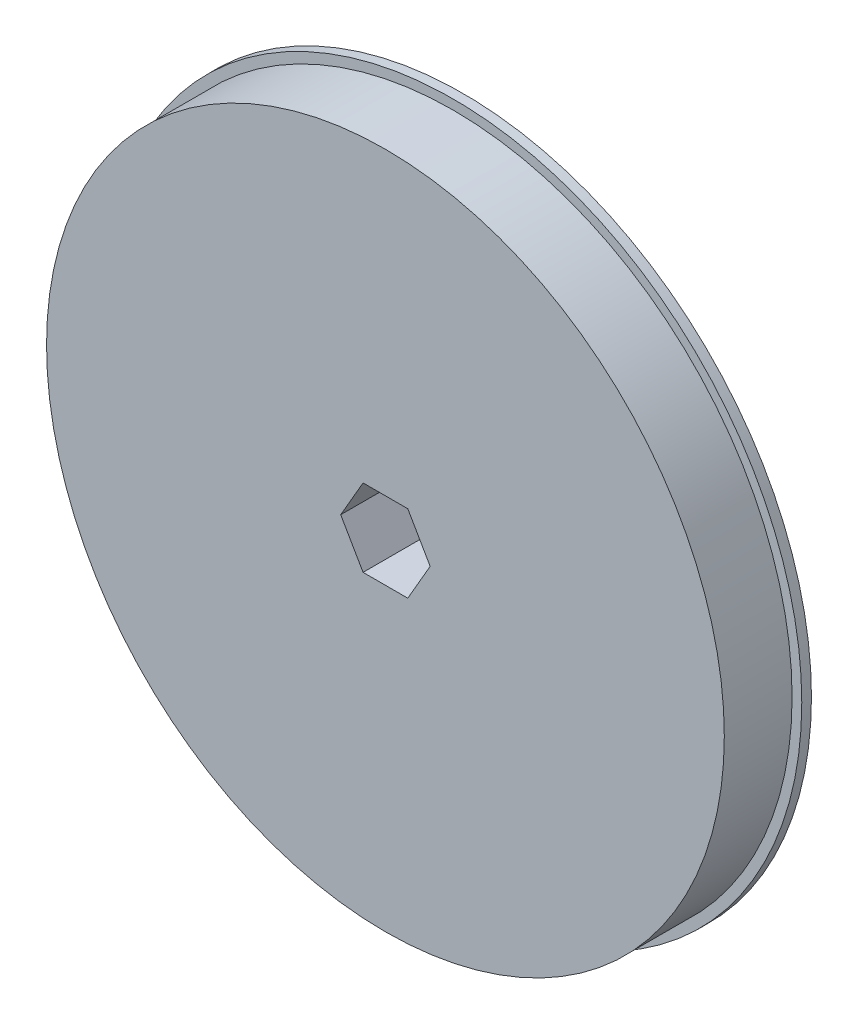
ISO-10303-21;
HEADER;
FILE_DESCRIPTION(('STEP AP214'),'2;1');
FILE_NAME('part.step','',(''),(''),'','','');
FILE_SCHEMA(('AUTOMOTIVE_DESIGN { 1 0 10303 214 1 1 1 1 }'));
ENDSEC;
DATA;
#1=APPLICATION_CONTEXT('core data for automotive mechanical design processes');
#2=APPLICATION_PROTOCOL_DEFINITION('international standard','automotive_design',2000,#1);
#3=PRODUCT_CONTEXT('',#1,'mechanical');
#4=PRODUCT('Part','Part','',(#3));
#5=PRODUCT_RELATED_PRODUCT_CATEGORY('part','',(#4));
#6=PRODUCT_DEFINITION_FORMATION('','',#4);
#7=PRODUCT_DEFINITION_CONTEXT('part definition',#1,'design');
#8=PRODUCT_DEFINITION('design','',#6,#7);
#9=PRODUCT_DEFINITION_SHAPE('','',#8);
#10=(LENGTH_UNIT() NAMED_UNIT(*) SI_UNIT(.MILLI.,.METRE.));
#11=(NAMED_UNIT(*) PLANE_ANGLE_UNIT() SI_UNIT($,.RADIAN.));
#12=(NAMED_UNIT(*) SI_UNIT($,.STERADIAN.) SOLID_ANGLE_UNIT());
#13=UNCERTAINTY_MEASURE_WITH_UNIT(LENGTH_MEASURE(1.E-05),#10,'distance_accuracy_value','');
#14=(GEOMETRIC_REPRESENTATION_CONTEXT(3) GLOBAL_UNCERTAINTY_ASSIGNED_CONTEXT((#13)) GLOBAL_UNIT_ASSIGNED_CONTEXT((#10,
#11,#12)) REPRESENTATION_CONTEXT('',''));
#15=CARTESIAN_POINT('',(0.,0.,0.));
#16=DIRECTION('',(0.,0.,1.));
#17=DIRECTION('',(1.,0.,0.));
#18=AXIS2_PLACEMENT_3D('',#15,#16,#17);
#19=CARTESIAN_POINT('',(0.,0.,9.525));
#20=DIRECTION('',(0.,0.,-1.));
#21=DIRECTION('',(-1.,0.,0.));
#22=AXIS2_PLACEMENT_3D('',#19,#20,#21);
#23=PLANE('',#22);
#24=CARTESIAN_POINT('',(0.,0.,9.525));
#25=DIRECTION('',(0.,0.,-1.));
#26=DIRECTION('',(-1.,0.,0.));
#27=AXIS2_PLACEMENT_3D('',#24,#25,#26);
#28=CIRCLE('',#27,50.8);
#29=CARTESIAN_POINT('',(-50.8,0.,9.525));
#30=VERTEX_POINT('',#29);
#31=EDGE_CURVE('E139',#30,#30,#28,.T.);
#32=ORIENTED_EDGE('',*,*,#31,.T.);
#33=EDGE_LOOP('',(#32));
#34=FACE_BOUND('',#33,.T.);
#35=CARTESIAN_POINT('',(0.,0.,9.525));
#36=DIRECTION('',(0.,0.,-1.));
#37=DIRECTION('',(-1.,0.,0.));
#38=AXIS2_PLACEMENT_3D('',#35,#36,#37);
#39=CIRCLE('',#38,12.7);
#40=CARTESIAN_POINT('',(-12.7,0.,9.525));
#41=VERTEX_POINT('',#40);
#42=EDGE_CURVE('E135',#41,#41,#39,.T.);
#43=ORIENTED_EDGE('',*,*,#42,.F.);
#44=EDGE_LOOP('',(#43));
#45=FACE_BOUND('',#44,.T.);
#46=ADVANCED_FACE('F33',(#34,#45),#23,.T.);
#47=CARTESIAN_POINT('',(0.,0.,12.7));
#48=DIRECTION('',(0.,0.,-1.));
#49=DIRECTION('',(-1.,0.,0.));
#50=AXIS2_PLACEMENT_3D('',#47,#48,#49);
#51=CYLINDRICAL_SURFACE('',#50,57.15);
#52=CARTESIAN_POINT('',(0.,0.,0.));
#53=DIRECTION('',(0.,0.,1.));
#54=DIRECTION('',(1.,0.,0.));
#55=AXIS2_PLACEMENT_3D('',#52,#53,#54);
#56=CIRCLE('',#55,57.15);
#57=CARTESIAN_POINT('',(57.15,0.,0.));
#58=VERTEX_POINT('',#57);
#59=EDGE_CURVE('E153',#58,#58,#56,.T.);
#60=ORIENTED_EDGE('',*,*,#59,.T.);
#61=EDGE_LOOP('',(#60));
#62=FACE_BOUND('',#61,.T.);
#63=CARTESIAN_POINT('',(0.,0.,1.5875));
#64=DIRECTION('',(0.,0.,1.));
#65=DIRECTION('',(1.,0.,0.));
#66=AXIS2_PLACEMENT_3D('',#63,#64,#65);
#67=CIRCLE('',#66,57.15);
#68=CARTESIAN_POINT('',(57.15,0.,1.5875));
#69=VERTEX_POINT('',#68);
#70=EDGE_CURVE('E148',#69,#69,#67,.T.);
#71=ORIENTED_EDGE('',*,*,#70,.F.);
#72=EDGE_LOOP('',(#71));
#73=FACE_BOUND('',#72,.T.);
#74=ADVANCED_FACE('F167',(#62,#73),#51,.T.);
#75=CARTESIAN_POINT('',(0.,0.,0.));
#76=DIRECTION('',(0.,0.,1.));
#77=DIRECTION('',(1.,0.,0.));
#78=AXIS2_PLACEMENT_3D('',#75,#76,#77);
#79=PLANE('',#78);
#80=CARTESIAN_POINT('',(0.,0.,0.));
#81=DIRECTION('',(0.,0.,-1.));
#82=DIRECTION('',(-1.,0.,0.));
#83=AXIS2_PLACEMENT_3D('',#80,#81,#82);
#84=CIRCLE('',#83,50.8);
#85=CARTESIAN_POINT('',(-50.8,0.,0.));
#86=VERTEX_POINT('',#85);
#87=EDGE_CURVE('E138',#86,#86,#84,.T.);
#88=ORIENTED_EDGE('',*,*,#87,.F.);
#89=EDGE_LOOP('',(#88));
#90=FACE_BOUND('',#89,.T.);
#91=ORIENTED_EDGE('',*,*,#59,.F.);
#92=EDGE_LOOP('',(#91));
#93=FACE_BOUND('',#92,.T.);
#94=ADVANCED_FACE('F173',(#90,#93),#79,.F.);
#95=CARTESIAN_POINT('',(0.,0.,1.5875));
#96=DIRECTION('',(0.,0.,1.));
#97=DIRECTION('',(1.,0.,0.));
#98=AXIS2_PLACEMENT_3D('',#95,#96,#97);
#99=PLANE('',#98);
#100=CARTESIAN_POINT('',(0.,0.,1.5875));
#101=DIRECTION('',(0.,0.,1.));
#102=DIRECTION('',(1.,0.,0.));
#103=AXIS2_PLACEMENT_3D('',#100,#101,#102);
#104=CIRCLE('',#103,55.5625);
#105=CARTESIAN_POINT('',(55.5625,0.,1.5875));
#106=VERTEX_POINT('',#105);
#107=EDGE_CURVE('E145',#106,#106,#104,.T.);
#108=ORIENTED_EDGE('',*,*,#107,.F.);
#109=EDGE_LOOP('',(#108));
#110=FACE_BOUND('',#109,.T.);
#111=ORIENTED_EDGE('',*,*,#70,.T.);
#112=EDGE_LOOP('',(#111));
#113=FACE_BOUND('',#112,.T.);
#114=ADVANCED_FACE('F188',(#110,#113),#99,.T.);
#115=CARTESIAN_POINT('',(0.,0.,1.5875));
#116=DIRECTION('',(0.,0.,1.));
#117=DIRECTION('',(1.,0.,0.));
#118=AXIS2_PLACEMENT_3D('',#115,#116,#117);
#119=CYLINDRICAL_SURFACE('',#118,55.5625);
#120=ORIENTED_EDGE('',*,*,#107,.T.);
#121=EDGE_LOOP('',(#120));
#122=FACE_BOUND('',#121,.T.);
#123=CARTESIAN_POINT('',(0.,0.,12.7));
#124=DIRECTION('',(0.,0.,1.));
#125=DIRECTION('',(1.,0.,0.));
#126=AXIS2_PLACEMENT_3D('',#123,#124,#125);
#127=CIRCLE('',#126,55.5625);
#128=CARTESIAN_POINT('',(55.5625,0.,12.7));
#129=VERTEX_POINT('',#128);
#130=EDGE_CURVE('E142',#129,#129,#127,.T.);
#131=ORIENTED_EDGE('',*,*,#130,.F.);
#132=EDGE_LOOP('',(#131));
#133=FACE_BOUND('',#132,.T.);
#134=ADVANCED_FACE('F185',(#122,#133),#119,.T.);
#135=CARTESIAN_POINT('',(0.,0.,12.7));
#136=DIRECTION('',(0.,0.,1.));
#137=DIRECTION('',(1.,0.,0.));
#138=AXIS2_PLACEMENT_3D('',#135,#136,#137);
#139=PLANE('',#138);
#140=DIRECTION('',(0.5,-0.866025403784439,0.));
#141=VECTOR('',#140,1.);
#142=CARTESIAN_POINT('',(-5.49926131403119,-3.175,12.7));
#143=LINE('',#142,#141);
#144=CARTESIAN_POINT('',(-7.33234841870825,0.,12.7));
#145=VERTEX_POINT('',#144);
#146=CARTESIAN_POINT('',(-3.66617420935412,-6.35,12.7));
#147=VERTEX_POINT('',#146);
#148=EDGE_CURVE('E133',#145,#147,#143,.T.);
#149=ORIENTED_EDGE('',*,*,#148,.F.);
#150=DIRECTION('',(-0.5,-0.866025403784439,0.));
#151=VECTOR('',#150,1.);
#152=CARTESIAN_POINT('',(-5.49926131403119,3.175,12.7));
#153=LINE('',#152,#151);
#154=CARTESIAN_POINT('',(-3.66617420935412,6.35,12.7));
#155=VERTEX_POINT('',#154);
#156=EDGE_CURVE('E118',#155,#145,#153,.T.);
#157=ORIENTED_EDGE('',*,*,#156,.F.);
#158=DIRECTION('',(-1.,0.,0.));
#159=VECTOR('',#158,1.);
#160=CARTESIAN_POINT('',(0.,6.35,12.7));
#161=LINE('',#160,#159);
#162=CARTESIAN_POINT('',(3.66617420935412,6.35000000000001,12.7));
#163=VERTEX_POINT('',#162);
#164=EDGE_CURVE('E92',#163,#155,#161,.T.);
#165=ORIENTED_EDGE('',*,*,#164,.F.);
#166=DIRECTION('',(-0.5,0.866025403784439,0.));
#167=VECTOR('',#166,1.);
#168=CARTESIAN_POINT('',(5.49926131403119,3.175,12.7));
#169=LINE('',#168,#167);
#170=CARTESIAN_POINT('',(7.33234841870825,0.,12.7));
#171=VERTEX_POINT('',#170);
#172=EDGE_CURVE('E127',#171,#163,#169,.T.);
#173=ORIENTED_EDGE('',*,*,#172,.F.);
#174=DIRECTION('',(0.5,0.866025403784439,0.));
#175=VECTOR('',#174,1.);
#176=CARTESIAN_POINT('',(5.49926131403119,-3.175,12.7));
#177=LINE('',#176,#175);
#178=CARTESIAN_POINT('',(3.66617420935413,-6.35,12.7));
#179=VERTEX_POINT('',#178);
#180=EDGE_CURVE('E129',#179,#171,#177,.T.);
#181=ORIENTED_EDGE('',*,*,#180,.F.);
#182=DIRECTION('',(1.,0.,0.));
#183=VECTOR('',#182,1.);
#184=CARTESIAN_POINT('',(0.,-6.35,12.7));
#185=LINE('',#184,#183);
#186=EDGE_CURVE('E131',#147,#179,#185,.T.);
#187=ORIENTED_EDGE('',*,*,#186,.F.);
#188=EDGE_LOOP('',(#149,#157,#165,#173,#181,#187));
#189=FACE_BOUND('',#188,.T.);
#190=ORIENTED_EDGE('',*,*,#130,.T.);
#191=EDGE_LOOP('',(#190));
#192=FACE_BOUND('',#191,.T.);
#193=ADVANCED_FACE('F183',(#189,#192),#139,.T.);
#194=CARTESIAN_POINT('',(0.,0.,9.525));
#195=DIRECTION('',(0.,0.,-1.));
#196=DIRECTION('',(-1.,0.,0.));
#197=AXIS2_PLACEMENT_3D('',#194,#195,#196);
#198=CYLINDRICAL_SURFACE('',#197,50.8);
#199=CARTESIAN_POINT('',(-50.8,0.,9.525));
#200=CARTESIAN_POINT('',(-50.8,0.,9.42578125));
#201=CARTESIAN_POINT('',(-50.8,0.,9.3265625));
#202=CARTESIAN_POINT('',(-50.8,0.,9.128125));
#203=CARTESIAN_POINT('',(-50.8,0.,9.02890625));
#204=CARTESIAN_POINT('',(-50.8,0.,8.83046875));
#205=CARTESIAN_POINT('',(-50.8,0.,8.73125));
#206=CARTESIAN_POINT('',(-50.8,0.,8.5328125));
#207=CARTESIAN_POINT('',(-50.8,0.,8.43359375));
#208=CARTESIAN_POINT('',(-50.8,0.,8.23515625));
#209=CARTESIAN_POINT('',(-50.8,0.,8.1359375));
#210=CARTESIAN_POINT('',(-50.8,0.,7.9375));
#211=CARTESIAN_POINT('',(-50.8,0.,7.83828125));
#212=CARTESIAN_POINT('',(-50.8,0.,7.63984375));
#213=CARTESIAN_POINT('',(-50.8,0.,7.540625));
#214=CARTESIAN_POINT('',(-50.8,0.,7.3421875));
#215=CARTESIAN_POINT('',(-50.8,0.,7.24296875));
#216=CARTESIAN_POINT('',(-50.8,0.,7.04453125));
#217=CARTESIAN_POINT('',(-50.8,0.,6.9453125));
#218=CARTESIAN_POINT('',(-50.8,0.,6.746875));
#219=CARTESIAN_POINT('',(-50.8,0.,6.64765625));
#220=CARTESIAN_POINT('',(-50.8,0.,6.44921875));
#221=CARTESIAN_POINT('',(-50.8,0.,6.35));
#222=CARTESIAN_POINT('',(-50.8,0.,6.1515625));
#223=CARTESIAN_POINT('',(-50.8,0.,6.05234375));
#224=CARTESIAN_POINT('',(-50.8,0.,5.85390625));
#225=CARTESIAN_POINT('',(-50.8,0.,5.7546875));
#226=CARTESIAN_POINT('',(-50.8,0.,5.55625));
#227=CARTESIAN_POINT('',(-50.8,0.,5.45703125));
#228=CARTESIAN_POINT('',(-50.8,0.,5.25859375));
#229=CARTESIAN_POINT('',(-50.8,0.,5.159375));
#230=CARTESIAN_POINT('',(-50.8,0.,4.9609375));
#231=CARTESIAN_POINT('',(-50.8,0.,4.86171875));
#232=CARTESIAN_POINT('',(-50.8,0.,4.66328125));
#233=CARTESIAN_POINT('',(-50.8,0.,4.5640625));
#234=CARTESIAN_POINT('',(-50.8,0.,4.365625));
#235=CARTESIAN_POINT('',(-50.8,0.,4.26640625));
#236=CARTESIAN_POINT('',(-50.8,0.,4.06796875));
#237=CARTESIAN_POINT('',(-50.8,0.,3.96875));
#238=CARTESIAN_POINT('',(-50.8,0.,3.7703125));
#239=CARTESIAN_POINT('',(-50.8,0.,3.67109375));
#240=CARTESIAN_POINT('',(-50.8,0.,3.47265625));
#241=CARTESIAN_POINT('',(-50.8,0.,3.3734375));
#242=CARTESIAN_POINT('',(-50.8,0.,3.175));
#243=CARTESIAN_POINT('',(-50.8,0.,3.07578125));
#244=CARTESIAN_POINT('',(-50.8,0.,2.87734375));
#245=CARTESIAN_POINT('',(-50.8,0.,2.778125));
#246=CARTESIAN_POINT('',(-50.8,0.,2.5796875));
#247=CARTESIAN_POINT('',(-50.8,0.,2.48046875));
#248=CARTESIAN_POINT('',(-50.8,0.,2.28203125));
#249=CARTESIAN_POINT('',(-50.8,0.,2.1828125));
#250=CARTESIAN_POINT('',(-50.8,0.,1.984375));
#251=CARTESIAN_POINT('',(-50.8,0.,1.88515625));
#252=CARTESIAN_POINT('',(-50.8,0.,1.68671875));
#253=CARTESIAN_POINT('',(-50.8,0.,1.5875));
#254=CARTESIAN_POINT('',(-50.8,0.,1.3890625));
#255=CARTESIAN_POINT('',(-50.8,0.,1.28984375));
#256=CARTESIAN_POINT('',(-50.8,0.,1.09140625));
#257=CARTESIAN_POINT('',(-50.8,0.,0.992187500000001));
#258=CARTESIAN_POINT('',(-50.8,0.,0.793750000000001));
#259=CARTESIAN_POINT('',(-50.8,0.,0.69453125));
#260=CARTESIAN_POINT('',(-50.8,0.,0.49609375));
#261=CARTESIAN_POINT('',(-50.8,0.,0.396875));
#262=CARTESIAN_POINT('',(-50.8,0.,0.1984375));
#263=CARTESIAN_POINT('',(-50.8,0.,0.0992187500000001));
#264=CARTESIAN_POINT('',(-50.8,0.,0.));
#265=B_SPLINE_CURVE_WITH_KNOTS('',3,(#199,#200,#201,#202,#203,#204,#205,#206,#207,#208,#209,
#210,#211,#212,#213,#214,#215,#216,#217,#218,#219,#220,#221,#222,#223,#224,#225,#226,#227,#228,
#229,#230,#231,#232,#233,#234,#235,#236,#237,#238,#239,#240,#241,#242,#243,#244,#245,#246,#247,
#248,#249,#250,#251,#252,#253,#254,#255,#256,#257,#258,#259,#260,#261,#262,#263,#264),
.UNSPECIFIED.,.F.,.F.,(4,2,2,2,2,2,2,2,2,2,2,2,2,2,2,2,2,2,2,2,2,2,2,2,2,2,2,2,2,2,2,2,4),(0.,
0.29765625,0.5953125,0.892968750000001,1.190625,1.48828125,1.7859375,2.08359375,2.38125,
2.67890625,2.9765625,3.27421875,3.571875,3.86953125,4.1671875,4.46484375,4.7625,5.06015625,
5.3578125,5.65546875,5.953125,6.25078125,6.5484375,6.84609375,7.14375,7.44140625,7.7390625,
8.03671875,8.334375,8.63203125,8.9296875,9.22734375,9.525),.UNSPECIFIED.);
#266=EDGE_CURVE('BSEAM180',#30,#86,#265,.T.);
#267=ORIENTED_EDGE('',*,*,#31,.F.);
#268=ORIENTED_EDGE('',*,*,#87,.T.);
#269=ORIENTED_EDGE('',*,*,#266,.T.);
#270=ORIENTED_EDGE('',*,*,#266,.F.);
#271=EDGE_LOOP('',(#267,#269,#268,#270));
#272=FACE_BOUND('',#271,.T.);
#273=ADVANCED_FACE('F180',(#272),#198,.F.);
#274=CARTESIAN_POINT('',(0.,0.,3.175));
#275=DIRECTION('',(0.,0.,1.));
#276=DIRECTION('',(1.,0.,0.));
#277=AXIS2_PLACEMENT_3D('',#274,#275,#276);
#278=CYLINDRICAL_SURFACE('',#277,12.7);
#279=CARTESIAN_POINT('',(0.,0.,3.96875000000003));
#280=DIRECTION('',(0.,0.,-1.));
#281=DIRECTION('',(-1.,0.,0.));
#282=AXIS2_PLACEMENT_3D('',#279,#280,#281);
#283=CIRCLE('',#282,12.7);
#284=CARTESIAN_POINT('',(-12.7,0.,3.96875000000003));
#285=VERTEX_POINT('',#284);
#286=EDGE_CURVE('E11',#285,#285,#283,.F.);
#287=ORIENTED_EDGE('',*,*,#286,.T.);
#288=EDGE_LOOP('',(#287));
#289=FACE_BOUND('',#288,.T.);
#290=ORIENTED_EDGE('',*,*,#42,.T.);
#291=EDGE_LOOP('',(#290));
#292=FACE_BOUND('',#291,.T.);
#293=ADVANCED_FACE('F178',(#289,#292),#278,.T.);
#294=CARTESIAN_POINT('',(0.,0.,3.175));
#295=DIRECTION('',(0.,0.,-1.));
#296=DIRECTION('',(-1.,0.,0.));
#297=AXIS2_PLACEMENT_3D('',#294,#295,#296);
#298=PLANE('',#297);
#299=CARTESIAN_POINT('',(0.,0.,3.175));
#300=DIRECTION('',(0.,0.,-1.));
#301=DIRECTION('',(-1.,0.,0.));
#302=AXIS2_PLACEMENT_3D('',#299,#300,#301);
#303=CIRCLE('',#302,11.90625);
#304=CARTESIAN_POINT('',(-11.90625,0.,3.175));
#305=VERTEX_POINT('',#304);
#306=EDGE_CURVE('E41',#305,#305,#303,.T.);
#307=ORIENTED_EDGE('',*,*,#306,.T.);
#308=EDGE_LOOP('',(#307));
#309=FACE_BOUND('',#308,.T.);
#310=DIRECTION('',(-0.5,0.866025403784439,0.));
#311=VECTOR('',#310,1.);
#312=CARTESIAN_POINT('',(-3.66617420935412,-6.35,3.175));
#313=LINE('',#312,#311);
#314=CARTESIAN_POINT('',(-3.66617420935412,-6.35,3.175));
#315=VERTEX_POINT('',#314);
#316=CARTESIAN_POINT('',(-7.33234841870825,0.,3.175));
#317=VERTEX_POINT('',#316);
#318=EDGE_CURVE('E56',#315,#317,#313,.T.);
#319=ORIENTED_EDGE('',*,*,#318,.F.);
#320=DIRECTION('',(-1.,0.,0.));
#321=VECTOR('',#320,1.);
#322=CARTESIAN_POINT('',(3.66617420935413,-6.35,3.175));
#323=LINE('',#322,#321);
#324=CARTESIAN_POINT('',(3.66617420935413,-6.35,3.175));
#325=VERTEX_POINT('',#324);
#326=EDGE_CURVE('E113',#325,#315,#323,.T.);
#327=ORIENTED_EDGE('',*,*,#326,.F.);
#328=DIRECTION('',(-0.5,-0.866025403784439,0.));
#329=VECTOR('',#328,1.);
#330=CARTESIAN_POINT('',(7.33234841870825,0.,3.175));
#331=LINE('',#330,#329);
#332=CARTESIAN_POINT('',(7.33234841870825,0.,3.175));
#333=VERTEX_POINT('',#332);
#334=EDGE_CURVE('E107',#333,#325,#331,.T.);
#335=ORIENTED_EDGE('',*,*,#334,.F.);
#336=DIRECTION('',(0.5,-0.866025403784439,0.));
#337=VECTOR('',#336,1.);
#338=CARTESIAN_POINT('',(3.66617420935412,6.35000000000001,3.175));
#339=LINE('',#338,#337);
#340=CARTESIAN_POINT('',(3.66617420935412,6.35000000000001,3.175));
#341=VERTEX_POINT('',#340);
#342=EDGE_CURVE('E105',#341,#333,#339,.T.);
#343=ORIENTED_EDGE('',*,*,#342,.F.);
#344=DIRECTION('',(1.,0.,0.));
#345=VECTOR('',#344,1.);
#346=CARTESIAN_POINT('',(-3.66617420935412,6.35,3.175));
#347=LINE('',#346,#345);
#348=CARTESIAN_POINT('',(-3.66617420935412,6.35,3.175));
#349=VERTEX_POINT('',#348);
#350=EDGE_CURVE('E89',#349,#341,#347,.T.);
#351=ORIENTED_EDGE('',*,*,#350,.F.);
#352=DIRECTION('',(0.5,0.866025403784439,0.));
#353=VECTOR('',#352,1.);
#354=CARTESIAN_POINT('',(-7.33234841870825,0.,3.175));
#355=LINE('',#354,#353);
#356=EDGE_CURVE('E98',#317,#349,#355,.T.);
#357=ORIENTED_EDGE('',*,*,#356,.F.);
#358=EDGE_LOOP('',(#319,#327,#335,#343,#351,#357));
#359=FACE_BOUND('',#358,.T.);
#360=ADVANCED_FACE('F102',(#309,#359),#298,.T.);
#361=CARTESIAN_POINT('',(-3.66617420935412,-6.35,15.875));
#362=DIRECTION('',(-0.866025403784439,-0.5,0.));
#363=DIRECTION('',(0.5,-0.866025403784439,0.));
#364=AXIS2_PLACEMENT_3D('',#361,#362,#363);
#365=PLANE('',#364);
#366=ORIENTED_EDGE('',*,*,#148,.T.);
#367=DIRECTION('',(0.,0.,-1.));
#368=VECTOR('',#367,1.);
#369=CARTESIAN_POINT('',(-3.66617420935412,-6.35,15.875));
#370=LINE('',#369,#368);
#371=EDGE_CURVE('E116',#147,#315,#370,.T.);
#372=ORIENTED_EDGE('',*,*,#371,.T.);
#373=ORIENTED_EDGE('',*,*,#318,.T.);
#374=DIRECTION('',(0.,0.,-1.));
#375=VECTOR('',#374,1.);
#376=CARTESIAN_POINT('',(-7.33234841870825,0.,15.875));
#377=LINE('',#376,#375);
#378=EDGE_CURVE('E95',#145,#317,#377,.T.);
#379=ORIENTED_EDGE('',*,*,#378,.F.);
#380=EDGE_LOOP('',(#366,#372,#373,#379));
#381=FACE_BOUND('',#380,.T.);
#382=ADVANCED_FACE('F239',(#381),#365,.F.);
#383=CARTESIAN_POINT('',(3.66617420935413,-6.35,15.875));
#384=DIRECTION('',(0.,-1.,0.));
#385=DIRECTION('',(1.,0.,0.));
#386=AXIS2_PLACEMENT_3D('',#383,#384,#385);
#387=PLANE('',#386);
#388=ORIENTED_EDGE('',*,*,#186,.T.);
#389=DIRECTION('',(0.,0.,-1.));
#390=VECTOR('',#389,1.);
#391=CARTESIAN_POINT('',(3.66617420935413,-6.35,15.875));
#392=LINE('',#391,#390);
#393=EDGE_CURVE('E119',#179,#325,#392,.T.);
#394=ORIENTED_EDGE('',*,*,#393,.T.);
#395=ORIENTED_EDGE('',*,*,#326,.T.);
#396=ORIENTED_EDGE('',*,*,#371,.F.);
#397=EDGE_LOOP('',(#388,#394,#395,#396));
#398=FACE_BOUND('',#397,.T.);
#399=ADVANCED_FACE('F244',(#398),#387,.F.);
#400=CARTESIAN_POINT('',(7.33234841870825,0.,15.875));
#401=DIRECTION('',(0.866025403784439,-0.5,0.));
#402=DIRECTION('',(0.5,0.866025403784439,0.));
#403=AXIS2_PLACEMENT_3D('',#400,#401,#402);
#404=PLANE('',#403);
#405=ORIENTED_EDGE('',*,*,#180,.T.);
#406=DIRECTION('',(0.,0.,-1.));
#407=VECTOR('',#406,1.);
#408=CARTESIAN_POINT('',(7.33234841870825,0.,15.875));
#409=LINE('',#408,#407);
#410=EDGE_CURVE('E121',#171,#333,#409,.T.);
#411=ORIENTED_EDGE('',*,*,#410,.T.);
#412=ORIENTED_EDGE('',*,*,#334,.T.);
#413=ORIENTED_EDGE('',*,*,#393,.F.);
#414=EDGE_LOOP('',(#405,#411,#412,#413));
#415=FACE_BOUND('',#414,.T.);
#416=ADVANCED_FACE('F251',(#415),#404,.F.);
#417=CARTESIAN_POINT('',(3.66617420935412,6.35000000000001,15.875));
#418=DIRECTION('',(0.866025403784439,0.5,0.));
#419=DIRECTION('',(-0.5,0.866025403784439,0.));
#420=AXIS2_PLACEMENT_3D('',#417,#418,#419);
#421=PLANE('',#420);
#422=ORIENTED_EDGE('',*,*,#172,.T.);
#423=DIRECTION('',(0.,0.,-1.));
#424=VECTOR('',#423,1.);
#425=CARTESIAN_POINT('',(3.66617420935412,6.35000000000001,15.875));
#426=LINE('',#425,#424);
#427=EDGE_CURVE('E94',#163,#341,#426,.T.);
#428=ORIENTED_EDGE('',*,*,#427,.T.);
#429=ORIENTED_EDGE('',*,*,#342,.T.);
#430=ORIENTED_EDGE('',*,*,#410,.F.);
#431=EDGE_LOOP('',(#422,#428,#429,#430));
#432=FACE_BOUND('',#431,.T.);
#433=ADVANCED_FACE('F259',(#432),#421,.F.);
#434=CARTESIAN_POINT('',(-3.66617420935412,6.35,15.875));
#435=DIRECTION('',(0.,1.,0.));
#436=DIRECTION('',(-1.,0.,0.));
#437=AXIS2_PLACEMENT_3D('',#434,#435,#436);
#438=PLANE('',#437);
#439=ORIENTED_EDGE('',*,*,#164,.T.);
#440=DIRECTION('',(0.,0.,-1.));
#441=VECTOR('',#440,1.);
#442=CARTESIAN_POINT('',(-3.66617420935412,6.35,15.875));
#443=LINE('',#442,#441);
#444=EDGE_CURVE('E48',#155,#349,#443,.T.);
#445=ORIENTED_EDGE('',*,*,#444,.T.);
#446=ORIENTED_EDGE('',*,*,#350,.T.);
#447=ORIENTED_EDGE('',*,*,#427,.F.);
#448=EDGE_LOOP('',(#439,#445,#446,#447));
#449=FACE_BOUND('',#448,.T.);
#450=ADVANCED_FACE('F86',(#449),#438,.F.);
#451=CARTESIAN_POINT('',(-7.33234841870825,0.,15.875));
#452=DIRECTION('',(-0.866025403784439,0.5,0.));
#453=DIRECTION('',(-0.5,-0.866025403784439,0.));
#454=AXIS2_PLACEMENT_3D('',#451,#452,#453);
#455=PLANE('',#454);
#456=ORIENTED_EDGE('',*,*,#156,.T.);
#457=ORIENTED_EDGE('',*,*,#378,.T.);
#458=ORIENTED_EDGE('',*,*,#356,.T.);
#459=ORIENTED_EDGE('',*,*,#444,.F.);
#460=EDGE_LOOP('',(#456,#457,#458,#459));
#461=FACE_BOUND('',#460,.T.);
#462=ADVANCED_FACE('F99',(#461),#455,.F.);
#463=CARTESIAN_POINT('',(0.,0.,3.175));
#464=DIRECTION('',(0.,0.,1.));
#465=DIRECTION('',(1.,0.,0.));
#466=AXIS2_PLACEMENT_3D('',#463,#464,#465);
#467=CONICAL_SURFACE('',#466,11.90625,0.785398163397441);
#468=ORIENTED_EDGE('',*,*,#286,.F.);
#469=EDGE_LOOP('',(#468));
#470=FACE_BOUND('',#469,.T.);
#471=ORIENTED_EDGE('',*,*,#306,.F.);
#472=EDGE_LOOP('',(#471));
#473=FACE_BOUND('',#472,.T.);
#474=ADVANCED_FACE('F35',(#470,#473),#467,.T.);
#475=CLOSED_SHELL('',(#46,#74,#94,#114,#134,#193,#273,#293,#360,#382,#399,#416,#433,#450,#462,#474));
#476=MANIFOLD_SOLID_BREP('B2',#475);
#477=ADVANCED_BREP_SHAPE_REPRESENTATION('',(#18,#476),#14);
#478=SHAPE_DEFINITION_REPRESENTATION(#9,#477);
ENDSEC;
END-ISO-10303-21;
